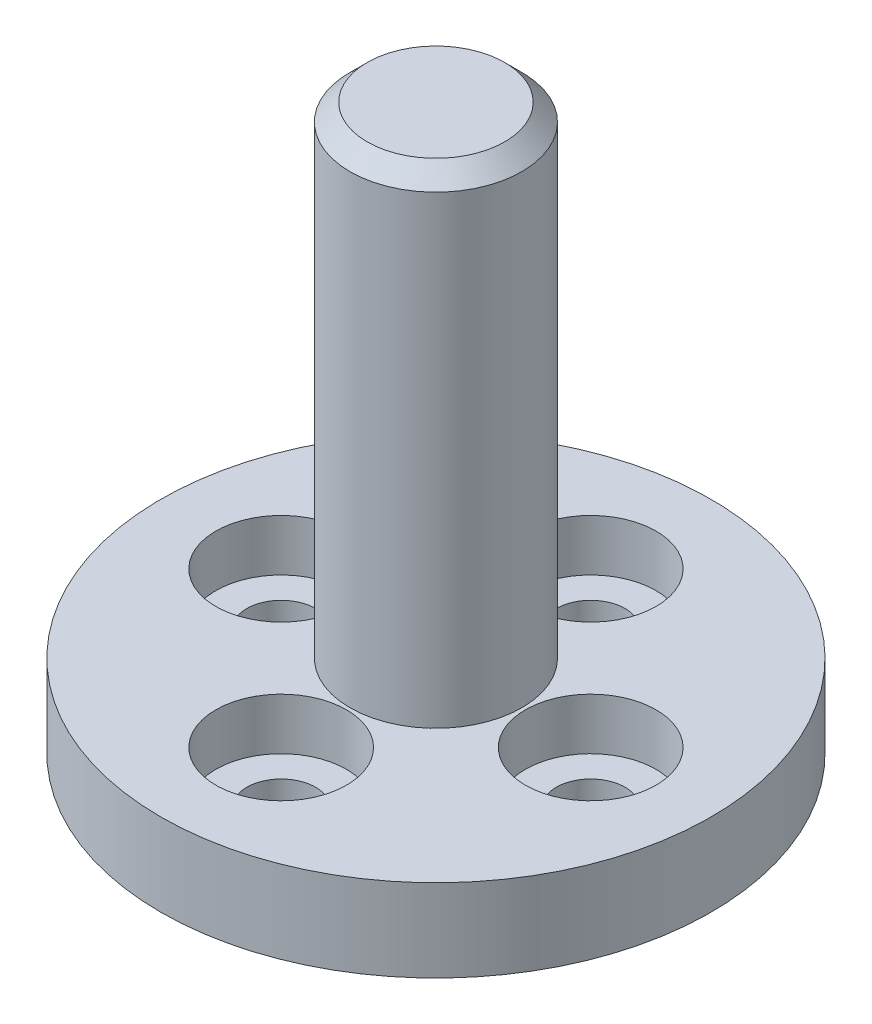
ISO-10303-21;
HEADER;
FILE_DESCRIPTION(('STEP AP214'),'2;1');
FILE_NAME('part.step','',(''),(''),'','','');
FILE_SCHEMA(('AUTOMOTIVE_DESIGN { 1 0 10303 214 1 1 1 1 }'));
ENDSEC;
DATA;
#1=APPLICATION_CONTEXT('core data for automotive mechanical design processes');
#2=APPLICATION_PROTOCOL_DEFINITION('international standard','automotive_design',2000,#1);
#3=PRODUCT_CONTEXT('',#1,'mechanical');
#4=PRODUCT('Part','Part','',(#3));
#5=PRODUCT_RELATED_PRODUCT_CATEGORY('part','',(#4));
#6=PRODUCT_DEFINITION_FORMATION('','',#4);
#7=PRODUCT_DEFINITION_CONTEXT('part definition',#1,'design');
#8=PRODUCT_DEFINITION('design','',#6,#7);
#9=PRODUCT_DEFINITION_SHAPE('','',#8);
#10=(LENGTH_UNIT() NAMED_UNIT(*) SI_UNIT(.MILLI.,.METRE.));
#11=(NAMED_UNIT(*) PLANE_ANGLE_UNIT() SI_UNIT($,.RADIAN.));
#12=(NAMED_UNIT(*) SI_UNIT($,.STERADIAN.) SOLID_ANGLE_UNIT());
#13=UNCERTAINTY_MEASURE_WITH_UNIT(LENGTH_MEASURE(1.E-05),#10,'distance_accuracy_value','');
#14=(GEOMETRIC_REPRESENTATION_CONTEXT(3) GLOBAL_UNCERTAINTY_ASSIGNED_CONTEXT((#13)) GLOBAL_UNIT_ASSIGNED_CONTEXT((#10,
#11,#12)) REPRESENTATION_CONTEXT('',''));
#15=CARTESIAN_POINT('',(0.,0.,0.));
#16=DIRECTION('',(0.,0.,1.));
#17=DIRECTION('',(1.,0.,0.));
#18=AXIS2_PLACEMENT_3D('',#15,#16,#17);
#19=CARTESIAN_POINT('',(0.,-4.6,4.5));
#20=DIRECTION('',(0.,1.,0.));
#21=DIRECTION('',(0.,0.,1.));
#22=AXIS2_PLACEMENT_3D('',#19,#20,#21);
#23=CYLINDRICAL_SURFACE('',#22,1.);
#24=CARTESIAN_POINT('',(0.,0.,4.5));
#25=DIRECTION('',(0.,1.,0.));
#26=DIRECTION('',(0.,0.,1.));
#27=AXIS2_PLACEMENT_3D('',#24,#25,#26);
#28=CIRCLE('',#27,1.);
#29=CARTESIAN_POINT('',(0.,0.,5.5));
#30=VERTEX_POINT('',#29);
#31=EDGE_CURVE('E61',#30,#30,#28,.T.);
#32=ORIENTED_EDGE('',*,*,#31,.F.);
#33=EDGE_LOOP('',(#32));
#34=FACE_BOUND('',#33,.T.);
#35=CARTESIAN_POINT('',(0.,0.9,4.5));
#36=DIRECTION('',(0.,1.,0.));
#37=DIRECTION('',(0.,0.,1.));
#38=AXIS2_PLACEMENT_3D('',#35,#36,#37);
#39=CIRCLE('',#38,1.);
#40=CARTESIAN_POINT('',(0.,0.9,5.5));
#41=VERTEX_POINT('',#40);
#42=EDGE_CURVE('E57',#41,#41,#39,.F.);
#43=ORIENTED_EDGE('',*,*,#42,.F.);
#44=EDGE_LOOP('',(#43));
#45=FACE_BOUND('',#44,.T.);
#46=ADVANCED_FACE('F36',(#34,#45),#23,.F.);
#47=CARTESIAN_POINT('',(-4.5,-4.6,0.));
#48=DIRECTION('',(0.,1.,0.));
#49=DIRECTION('',(0.,0.,1.));
#50=AXIS2_PLACEMENT_3D('',#47,#48,#49);
#51=CYLINDRICAL_SURFACE('',#50,1.);
#52=CARTESIAN_POINT('',(-4.5,0.,0.));
#53=DIRECTION('',(0.,1.,0.));
#54=DIRECTION('',(0.,0.,1.));
#55=AXIS2_PLACEMENT_3D('',#52,#53,#54);
#56=CIRCLE('',#55,1.);
#57=CARTESIAN_POINT('',(-4.5,0.,1.));
#58=VERTEX_POINT('',#57);
#59=EDGE_CURVE('E76',#58,#58,#56,.T.);
#60=ORIENTED_EDGE('',*,*,#59,.F.);
#61=EDGE_LOOP('',(#60));
#62=FACE_BOUND('',#61,.T.);
#63=CARTESIAN_POINT('',(-4.5,0.9,0.));
#64=DIRECTION('',(0.,1.,0.));
#65=DIRECTION('',(0.,0.,1.));
#66=AXIS2_PLACEMENT_3D('',#63,#64,#65);
#67=CIRCLE('',#66,1.);
#68=CARTESIAN_POINT('',(-4.5,0.9,1.));
#69=VERTEX_POINT('',#68);
#70=EDGE_CURVE('E62',#69,#69,#67,.F.);
#71=ORIENTED_EDGE('',*,*,#70,.F.);
#72=EDGE_LOOP('',(#71));
#73=FACE_BOUND('',#72,.T.);
#74=ADVANCED_FACE('F176',(#62,#73),#51,.F.);
#75=CARTESIAN_POINT('',(0.,-4.6,-4.5));
#76=DIRECTION('',(0.,1.,0.));
#77=DIRECTION('',(0.,0.,1.));
#78=AXIS2_PLACEMENT_3D('',#75,#76,#77);
#79=CYLINDRICAL_SURFACE('',#78,1.);
#80=CARTESIAN_POINT('',(0.,0.,-4.5));
#81=DIRECTION('',(0.,1.,0.));
#82=DIRECTION('',(0.,0.,1.));
#83=AXIS2_PLACEMENT_3D('',#80,#81,#82);
#84=CIRCLE('',#83,1.);
#85=CARTESIAN_POINT('',(0.,0.,-3.5));
#86=VERTEX_POINT('',#85);
#87=EDGE_CURVE('E71',#86,#86,#84,.T.);
#88=ORIENTED_EDGE('',*,*,#87,.F.);
#89=EDGE_LOOP('',(#88));
#90=FACE_BOUND('',#89,.T.);
#91=CARTESIAN_POINT('',(0.,0.9,-4.5));
#92=DIRECTION('',(0.,1.,0.));
#93=DIRECTION('',(0.,0.,1.));
#94=AXIS2_PLACEMENT_3D('',#91,#92,#93);
#95=CIRCLE('',#94,1.);
#96=CARTESIAN_POINT('',(0.,0.9,-3.5));
#97=VERTEX_POINT('',#96);
#98=EDGE_CURVE('E66',#97,#97,#95,.F.);
#99=ORIENTED_EDGE('',*,*,#98,.F.);
#100=EDGE_LOOP('',(#99));
#101=FACE_BOUND('',#100,.T.);
#102=ADVANCED_FACE('F171',(#90,#101),#79,.F.);
#103=CARTESIAN_POINT('',(4.5,-4.6,0.));
#104=DIRECTION('',(0.,1.,0.));
#105=DIRECTION('',(0.,0.,1.));
#106=AXIS2_PLACEMENT_3D('',#103,#104,#105);
#107=CYLINDRICAL_SURFACE('',#106,1.);
#108=CARTESIAN_POINT('',(4.5,0.,0.));
#109=DIRECTION('',(0.,1.,0.));
#110=DIRECTION('',(0.,0.,1.));
#111=AXIS2_PLACEMENT_3D('',#108,#109,#110);
#112=CIRCLE('',#111,1.);
#113=CARTESIAN_POINT('',(4.5,0.,1.));
#114=VERTEX_POINT('',#113);
#115=EDGE_CURVE('E87',#114,#114,#112,.T.);
#116=ORIENTED_EDGE('',*,*,#115,.F.);
#117=EDGE_LOOP('',(#116));
#118=FACE_BOUND('',#117,.T.);
#119=CARTESIAN_POINT('',(4.5,0.9,0.));
#120=DIRECTION('',(0.,1.,0.));
#121=DIRECTION('',(0.,0.,1.));
#122=AXIS2_PLACEMENT_3D('',#119,#120,#121);
#123=CIRCLE('',#122,1.);
#124=CARTESIAN_POINT('',(4.5,0.9,1.));
#125=VERTEX_POINT('',#124);
#126=EDGE_CURVE('E83',#125,#125,#123,.F.);
#127=ORIENTED_EDGE('',*,*,#126,.F.);
#128=EDGE_LOOP('',(#127));
#129=FACE_BOUND('',#128,.T.);
#130=ADVANCED_FACE('F163',(#118,#129),#107,.F.);
#131=CARTESIAN_POINT('',(0.,2.4,0.));
#132=DIRECTION('',(0.,-1.,0.));
#133=DIRECTION('',(0.,0.,-1.));
#134=AXIS2_PLACEMENT_3D('',#131,#132,#133);
#135=CYLINDRICAL_SURFACE('',#134,8.);
#136=CARTESIAN_POINT('',(0.,2.4,0.));
#137=DIRECTION('',(0.,1.,0.));
#138=DIRECTION('',(0.,0.,1.));
#139=AXIS2_PLACEMENT_3D('',#136,#137,#138);
#140=CIRCLE('',#139,8.);
#141=CARTESIAN_POINT('',(0.,2.4,8.));
#142=VERTEX_POINT('',#141);
#143=EDGE_CURVE('E54',#142,#142,#140,.T.);
#144=ORIENTED_EDGE('',*,*,#143,.F.);
#145=EDGE_LOOP('',(#144));
#146=FACE_BOUND('',#145,.T.);
#147=CARTESIAN_POINT('',(0.,0.,0.));
#148=DIRECTION('',(0.,1.,0.));
#149=DIRECTION('',(0.,0.,1.));
#150=AXIS2_PLACEMENT_3D('',#147,#148,#149);
#151=CIRCLE('',#150,8.);
#152=CARTESIAN_POINT('',(0.,0.,8.));
#153=VERTEX_POINT('',#152);
#154=EDGE_CURVE('E92',#153,#153,#151,.T.);
#155=ORIENTED_EDGE('',*,*,#154,.T.);
#156=EDGE_LOOP('',(#155));
#157=FACE_BOUND('',#156,.T.);
#158=ADVANCED_FACE('F161',(#146,#157),#135,.T.);
#159=CARTESIAN_POINT('',(0.,2.4,0.));
#160=DIRECTION('',(0.,1.,0.));
#161=DIRECTION('',(0.,0.,1.));
#162=AXIS2_PLACEMENT_3D('',#159,#160,#161);
#163=PLANE('',#162);
#164=CARTESIAN_POINT('',(0.,2.4,-4.5));
#165=DIRECTION('',(0.,1.,0.));
#166=DIRECTION('',(1.,0.,0.));
#167=AXIS2_PLACEMENT_3D('',#164,#165,#166);
#168=CIRCLE('',#167,1.9);
#169=CARTESIAN_POINT('',(1.89999999999998,2.4,-4.50000000000001));
#170=VERTEX_POINT('',#169);
#171=EDGE_CURVE('E122',#170,#170,#168,.T.);
#172=ORIENTED_EDGE('',*,*,#171,.F.);
#173=EDGE_LOOP('',(#172));
#174=FACE_BOUND('',#173,.T.);
#175=CARTESIAN_POINT('',(-4.5,2.4,0.));
#176=DIRECTION('',(0.,1.,0.));
#177=DIRECTION('',(0.,0.,-1.));
#178=AXIS2_PLACEMENT_3D('',#175,#176,#177);
#179=CIRCLE('',#178,1.9);
#180=CARTESIAN_POINT('',(-4.5,2.4,-1.9));
#181=VERTEX_POINT('',#180);
#182=EDGE_CURVE('E114',#181,#181,#179,.T.);
#183=ORIENTED_EDGE('',*,*,#182,.F.);
#184=EDGE_LOOP('',(#183));
#185=FACE_BOUND('',#184,.T.);
#186=CARTESIAN_POINT('',(0.,2.4,4.5));
#187=DIRECTION('',(0.,1.,0.));
#188=DIRECTION('',(-1.,0.,0.));
#189=AXIS2_PLACEMENT_3D('',#186,#187,#188);
#190=CIRCLE('',#189,1.9);
#191=CARTESIAN_POINT('',(-1.89999999999995,2.4,4.50000000000002));
#192=VERTEX_POINT('',#191);
#193=EDGE_CURVE('E105',#192,#192,#190,.T.);
#194=ORIENTED_EDGE('',*,*,#193,.F.);
#195=EDGE_LOOP('',(#194));
#196=FACE_BOUND('',#195,.T.);
#197=CARTESIAN_POINT('',(4.5,2.4,0.));
#198=DIRECTION('',(0.,1.,0.));
#199=DIRECTION('',(0.,0.,1.));
#200=AXIS2_PLACEMENT_3D('',#197,#198,#199);
#201=CIRCLE('',#200,1.9);
#202=CARTESIAN_POINT('',(4.5,2.4,1.9));
#203=VERTEX_POINT('',#202);
#204=EDGE_CURVE('E75',#203,#203,#201,.T.);
#205=ORIENTED_EDGE('',*,*,#204,.F.);
#206=EDGE_LOOP('',(#205));
#207=FACE_BOUND('',#206,.T.);
#208=CARTESIAN_POINT('',(0.,2.4,0.));
#209=DIRECTION('',(0.,1.,0.));
#210=DIRECTION('',(0.,0.,1.));
#211=AXIS2_PLACEMENT_3D('',#208,#209,#210);
#212=CIRCLE('',#211,2.5);
#213=CARTESIAN_POINT('',(0.,2.4,2.5));
#214=VERTEX_POINT('',#213);
#215=EDGE_CURVE('E49',#214,#214,#212,.T.);
#216=ORIENTED_EDGE('',*,*,#215,.F.);
#217=EDGE_LOOP('',(#216));
#218=FACE_BOUND('',#217,.T.);
#219=ORIENTED_EDGE('',*,*,#143,.T.);
#220=EDGE_LOOP('',(#219));
#221=FACE_BOUND('',#220,.T.);
#222=ADVANCED_FACE('F149',(#174,#185,#196,#207,#218,#221),#163,.T.);
#223=CARTESIAN_POINT('',(0.,0.,0.));
#224=DIRECTION('',(0.,1.,0.));
#225=DIRECTION('',(0.,0.,1.));
#226=AXIS2_PLACEMENT_3D('',#223,#224,#225);
#227=PLANE('',#226);
#228=CARTESIAN_POINT('',(0.,0.,0.));
#229=DIRECTION('',(0.,-1.,0.));
#230=DIRECTION('',(0.,0.,-1.));
#231=AXIS2_PLACEMENT_3D('',#228,#229,#230);
#232=CIRCLE('',#231,1.);
#233=CARTESIAN_POINT('',(0.,0.,-1.));
#234=VERTEX_POINT('',#233);
#235=EDGE_CURVE('E129',#234,#234,#232,.T.);
#236=ORIENTED_EDGE('',*,*,#235,.F.);
#237=EDGE_LOOP('',(#236));
#238=FACE_BOUND('',#237,.T.);
#239=ORIENTED_EDGE('',*,*,#87,.T.);
#240=EDGE_LOOP('',(#239));
#241=FACE_BOUND('',#240,.T.);
#242=ORIENTED_EDGE('',*,*,#59,.T.);
#243=EDGE_LOOP('',(#242));
#244=FACE_BOUND('',#243,.T.);
#245=ORIENTED_EDGE('',*,*,#31,.T.);
#246=EDGE_LOOP('',(#245));
#247=FACE_BOUND('',#246,.T.);
#248=ORIENTED_EDGE('',*,*,#115,.T.);
#249=EDGE_LOOP('',(#248));
#250=FACE_BOUND('',#249,.T.);
#251=ORIENTED_EDGE('',*,*,#154,.F.);
#252=EDGE_LOOP('',(#251));
#253=FACE_BOUND('',#252,.T.);
#254=ADVANCED_FACE('F145',(#238,#241,#244,#247,#250,#253),#227,.F.);
#255=CARTESIAN_POINT('',(0.,16.4,0.));
#256=DIRECTION('',(0.,-1.,0.));
#257=DIRECTION('',(0.,0.,-1.));
#258=AXIS2_PLACEMENT_3D('',#255,#256,#257);
#259=CYLINDRICAL_SURFACE('',#258,2.5);
#260=CARTESIAN_POINT('',(0.,15.9,0.));
#261=DIRECTION('',(0.,1.,0.));
#262=DIRECTION('',(0.,0.,1.));
#263=AXIS2_PLACEMENT_3D('',#260,#261,#262);
#264=CIRCLE('',#263,2.5);
#265=CARTESIAN_POINT('',(0.,15.9,2.5));
#266=VERTEX_POINT('',#265);
#267=EDGE_CURVE('E10',#266,#266,#264,.F.);
#268=ORIENTED_EDGE('',*,*,#267,.T.);
#269=EDGE_LOOP('',(#268));
#270=FACE_BOUND('',#269,.T.);
#271=ORIENTED_EDGE('',*,*,#215,.T.);
#272=EDGE_LOOP('',(#271));
#273=FACE_BOUND('',#272,.T.);
#274=ADVANCED_FACE('F148',(#270,#273),#259,.T.);
#275=CARTESIAN_POINT('',(0.,16.4,0.));
#276=DIRECTION('',(0.,1.,0.));
#277=DIRECTION('',(0.,0.,1.));
#278=AXIS2_PLACEMENT_3D('',#275,#276,#277);
#279=PLANE('',#278);
#280=CARTESIAN_POINT('',(0.,16.4,0.));
#281=DIRECTION('',(0.,1.,0.));
#282=DIRECTION('',(0.,0.,1.));
#283=AXIS2_PLACEMENT_3D('',#280,#281,#282);
#284=CIRCLE('',#283,2.00000000000001);
#285=CARTESIAN_POINT('',(0.,16.4,2.00000000000001));
#286=VERTEX_POINT('',#285);
#287=EDGE_CURVE('E44',#286,#286,#284,.T.);
#288=ORIENTED_EDGE('',*,*,#287,.T.);
#289=EDGE_LOOP('',(#288));
#290=FACE_BOUND('',#289,.T.);
#291=ADVANCED_FACE('F191',(#290),#279,.T.);
#292=CARTESIAN_POINT('',(4.5,0.9,0.));
#293=DIRECTION('',(0.,1.,0.));
#294=DIRECTION('',(0.,0.,1.));
#295=AXIS2_PLACEMENT_3D('',#292,#293,#294);
#296=PLANE('',#295);
#297=CARTESIAN_POINT('',(4.5,0.9,0.));
#298=DIRECTION('',(0.,1.,0.));
#299=DIRECTION('',(0.,0.,1.));
#300=AXIS2_PLACEMENT_3D('',#297,#298,#299);
#301=CIRCLE('',#300,1.9);
#302=CARTESIAN_POINT('',(4.5,0.9,1.9));
#303=VERTEX_POINT('',#302);
#304=EDGE_CURVE('E88',#303,#303,#301,.T.);
#305=ORIENTED_EDGE('',*,*,#304,.T.);
#306=EDGE_LOOP('',(#305));
#307=FACE_BOUND('',#306,.T.);
#308=ORIENTED_EDGE('',*,*,#126,.T.);
#309=EDGE_LOOP('',(#308));
#310=FACE_BOUND('',#309,.T.);
#311=ADVANCED_FACE('F187',(#307,#310),#296,.T.);
#312=CARTESIAN_POINT('',(4.5,0.9,0.));
#313=DIRECTION('',(0.,1.,0.));
#314=DIRECTION('',(0.,0.,1.));
#315=AXIS2_PLACEMENT_3D('',#312,#313,#314);
#316=CYLINDRICAL_SURFACE('',#315,1.9);
#317=ORIENTED_EDGE('',*,*,#304,.F.);
#318=EDGE_LOOP('',(#317));
#319=FACE_BOUND('',#318,.T.);
#320=ORIENTED_EDGE('',*,*,#204,.T.);
#321=EDGE_LOOP('',(#320));
#322=FACE_BOUND('',#321,.T.);
#323=ADVANCED_FACE('F190',(#319,#322),#316,.F.);
#324=CARTESIAN_POINT('',(0.,0.9,-4.5));
#325=DIRECTION('',(0.,1.,0.));
#326=DIRECTION('',(1.,0.,0.));
#327=AXIS2_PLACEMENT_3D('',#324,#325,#326);
#328=PLANE('',#327);
#329=CARTESIAN_POINT('',(0.,0.9,-4.5));
#330=DIRECTION('',(0.,1.,0.));
#331=DIRECTION('',(1.,0.,0.));
#332=AXIS2_PLACEMENT_3D('',#329,#330,#331);
#333=CIRCLE('',#332,1.9);
#334=CARTESIAN_POINT('',(1.89999999999998,0.9,-4.50000000000001));
#335=VERTEX_POINT('',#334);
#336=EDGE_CURVE('E70',#335,#335,#333,.T.);
#337=ORIENTED_EDGE('',*,*,#336,.T.);
#338=EDGE_LOOP('',(#337));
#339=FACE_BOUND('',#338,.T.);
#340=ORIENTED_EDGE('',*,*,#98,.T.);
#341=EDGE_LOOP('',(#340));
#342=FACE_BOUND('',#341,.T.);
#343=ADVANCED_FACE('F194',(#339,#342),#328,.T.);
#344=CARTESIAN_POINT('',(0.,0.9,-4.5));
#345=DIRECTION('',(0.,1.,0.));
#346=DIRECTION('',(0.,0.,1.));
#347=AXIS2_PLACEMENT_3D('',#344,#345,#346);
#348=CYLINDRICAL_SURFACE('',#347,1.9);
#349=ORIENTED_EDGE('',*,*,#336,.F.);
#350=EDGE_LOOP('',(#349));
#351=FACE_BOUND('',#350,.T.);
#352=ORIENTED_EDGE('',*,*,#171,.T.);
#353=EDGE_LOOP('',(#352));
#354=FACE_BOUND('',#353,.T.);
#355=ADVANCED_FACE('F247',(#351,#354),#348,.F.);
#356=CARTESIAN_POINT('',(-4.5,0.9,0.));
#357=DIRECTION('',(0.,1.,0.));
#358=DIRECTION('',(0.,0.,-1.));
#359=AXIS2_PLACEMENT_3D('',#356,#357,#358);
#360=PLANE('',#359);
#361=CARTESIAN_POINT('',(-4.5,0.9,0.));
#362=DIRECTION('',(0.,1.,0.));
#363=DIRECTION('',(0.,0.,-1.));
#364=AXIS2_PLACEMENT_3D('',#361,#362,#363);
#365=CIRCLE('',#364,1.9);
#366=CARTESIAN_POINT('',(-4.5,0.9,-1.9));
#367=VERTEX_POINT('',#366);
#368=EDGE_CURVE('E118',#367,#367,#365,.T.);
#369=ORIENTED_EDGE('',*,*,#368,.T.);
#370=EDGE_LOOP('',(#369));
#371=FACE_BOUND('',#370,.T.);
#372=ORIENTED_EDGE('',*,*,#70,.T.);
#373=EDGE_LOOP('',(#372));
#374=FACE_BOUND('',#373,.T.);
#375=ADVANCED_FACE('F251',(#371,#374),#360,.T.);
#376=CARTESIAN_POINT('',(-4.5,0.9,0.));
#377=DIRECTION('',(0.,1.,0.));
#378=DIRECTION('',(0.,0.,1.));
#379=AXIS2_PLACEMENT_3D('',#376,#377,#378);
#380=CYLINDRICAL_SURFACE('',#379,1.9);
#381=ORIENTED_EDGE('',*,*,#368,.F.);
#382=EDGE_LOOP('',(#381));
#383=FACE_BOUND('',#382,.T.);
#384=ORIENTED_EDGE('',*,*,#182,.T.);
#385=EDGE_LOOP('',(#384));
#386=FACE_BOUND('',#385,.T.);
#387=ADVANCED_FACE('F255',(#383,#386),#380,.F.);
#388=CARTESIAN_POINT('',(0.,0.9,4.5));
#389=DIRECTION('',(0.,1.,0.));
#390=DIRECTION('',(-1.,0.,0.));
#391=AXIS2_PLACEMENT_3D('',#388,#389,#390);
#392=PLANE('',#391);
#393=CARTESIAN_POINT('',(0.,0.9,4.5));
#394=DIRECTION('',(0.,1.,0.));
#395=DIRECTION('',(-1.,0.,0.));
#396=AXIS2_PLACEMENT_3D('',#393,#394,#395);
#397=CIRCLE('',#396,1.9);
#398=CARTESIAN_POINT('',(-1.89999999999995,0.9,4.50000000000002));
#399=VERTEX_POINT('',#398);
#400=EDGE_CURVE('E109',#399,#399,#397,.T.);
#401=ORIENTED_EDGE('',*,*,#400,.T.);
#402=EDGE_LOOP('',(#401));
#403=FACE_BOUND('',#402,.T.);
#404=ORIENTED_EDGE('',*,*,#42,.T.);
#405=EDGE_LOOP('',(#404));
#406=FACE_BOUND('',#405,.T.);
#407=ADVANCED_FACE('F259',(#403,#406),#392,.T.);
#408=CARTESIAN_POINT('',(0.,0.9,4.5));
#409=DIRECTION('',(0.,1.,0.));
#410=DIRECTION('',(0.,0.,1.));
#411=AXIS2_PLACEMENT_3D('',#408,#409,#410);
#412=CYLINDRICAL_SURFACE('',#411,1.9);
#413=ORIENTED_EDGE('',*,*,#400,.F.);
#414=EDGE_LOOP('',(#413));
#415=FACE_BOUND('',#414,.T.);
#416=ORIENTED_EDGE('',*,*,#193,.T.);
#417=EDGE_LOOP('',(#416));
#418=FACE_BOUND('',#417,.T.);
#419=ADVANCED_FACE('F211',(#415,#418),#412,.F.);
#420=CARTESIAN_POINT('',(0.,16.4,0.));
#421=DIRECTION('',(0.,-1.,0.));
#422=DIRECTION('',(0.,0.,-1.));
#423=AXIS2_PLACEMENT_3D('',#420,#421,#422);
#424=CONICAL_SURFACE('',#423,2.00000000000001,0.785398163397446);
#425=ORIENTED_EDGE('',*,*,#267,.F.);
#426=EDGE_LOOP('',(#425));
#427=FACE_BOUND('',#426,.T.);
#428=ORIENTED_EDGE('',*,*,#287,.F.);
#429=EDGE_LOOP('',(#428));
#430=FACE_BOUND('',#429,.T.);
#431=ADVANCED_FACE('F38',(#427,#430),#424,.T.);
#432=CARTESIAN_POINT('',(0.,1.6,0.));
#433=DIRECTION('',(0.,-1.,0.));
#434=DIRECTION('',(0.,0.,-1.));
#435=AXIS2_PLACEMENT_3D('',#432,#433,#434);
#436=CYLINDRICAL_SURFACE('',#435,1.);
#437=CARTESIAN_POINT('',(0.,1.6,0.));
#438=DIRECTION('',(0.,-1.,0.));
#439=DIRECTION('',(0.,0.,-1.));
#440=AXIS2_PLACEMENT_3D('',#437,#438,#439);
#441=CIRCLE('',#440,1.);
#442=CARTESIAN_POINT('',(0.,1.6,-1.));
#443=VERTEX_POINT('',#442);
#444=EDGE_CURVE('E110',#443,#443,#441,.T.);
#445=ORIENTED_EDGE('',*,*,#444,.F.);
#446=EDGE_LOOP('',(#445));
#447=FACE_BOUND('',#446,.T.);
#448=ORIENTED_EDGE('',*,*,#235,.T.);
#449=EDGE_LOOP('',(#448));
#450=FACE_BOUND('',#449,.T.);
#451=ADVANCED_FACE('F139',(#447,#450),#436,.F.);
#452=CARTESIAN_POINT('',(0.,1.6,0.));
#453=DIRECTION('',(0.,-1.,0.));
#454=DIRECTION('',(0.,0.,-1.));
#455=AXIS2_PLACEMENT_3D('',#452,#453,#454);
#456=PLANE('',#455);
#457=ORIENTED_EDGE('',*,*,#444,.T.);
#458=EDGE_LOOP('',(#457));
#459=FACE_BOUND('',#458,.T.);
#460=ADVANCED_FACE('F137',(#459),#456,.T.);
#461=CLOSED_SHELL('',(#46,#74,#102,#130,#158,#222,#254,#274,#291,#311,#323,#343,#355,#375,#387,
#407,#419,#431,#451,#460));
#462=MANIFOLD_SOLID_BREP('B2',#461);
#463=ADVANCED_BREP_SHAPE_REPRESENTATION('',(#18,#462),#14);
#464=SHAPE_DEFINITION_REPRESENTATION(#9,#463);
ENDSEC;
END-ISO-10303-21;
